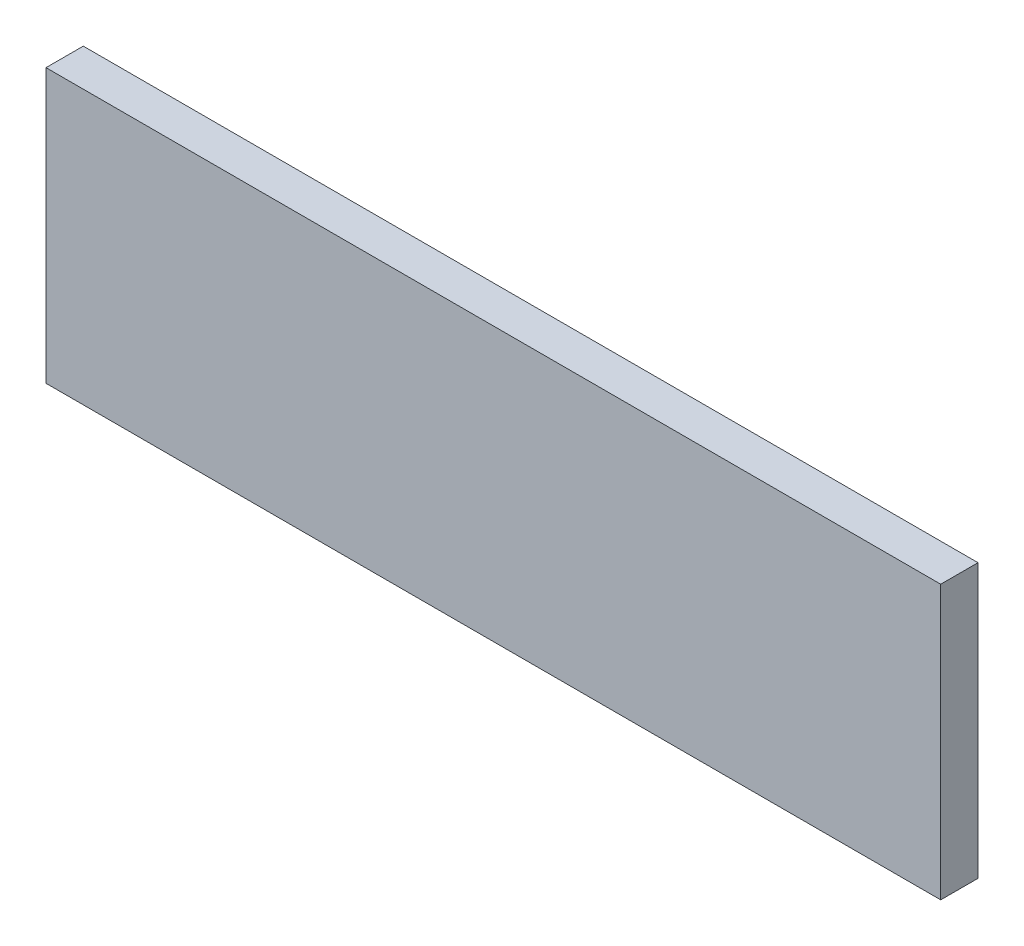
ISO-10303-21;
HEADER;
FILE_DESCRIPTION(('STEP AP214'),'2;1');
FILE_NAME('part.step','',(''),(''),'','','');
FILE_SCHEMA(('AUTOMOTIVE_DESIGN { 1 0 10303 214 1 1 1 1 }'));
ENDSEC;
DATA;
#1=APPLICATION_CONTEXT('core data for automotive mechanical design processes');
#2=APPLICATION_PROTOCOL_DEFINITION('international standard','automotive_design',2000,#1);
#3=PRODUCT_CONTEXT('',#1,'mechanical');
#4=PRODUCT('Part','Part','',(#3));
#5=PRODUCT_RELATED_PRODUCT_CATEGORY('part','',(#4));
#6=PRODUCT_DEFINITION_FORMATION('','',#4);
#7=PRODUCT_DEFINITION_CONTEXT('part definition',#1,'design');
#8=PRODUCT_DEFINITION('design','',#6,#7);
#9=PRODUCT_DEFINITION_SHAPE('','',#8);
#10=(LENGTH_UNIT() NAMED_UNIT(*) SI_UNIT(.MILLI.,.METRE.));
#11=(NAMED_UNIT(*) PLANE_ANGLE_UNIT() SI_UNIT($,.RADIAN.));
#12=(NAMED_UNIT(*) SI_UNIT($,.STERADIAN.) SOLID_ANGLE_UNIT());
#13=UNCERTAINTY_MEASURE_WITH_UNIT(LENGTH_MEASURE(1.E-05),#10,'distance_accuracy_value','');
#14=(GEOMETRIC_REPRESENTATION_CONTEXT(3) GLOBAL_UNCERTAINTY_ASSIGNED_CONTEXT((#13)) GLOBAL_UNIT_ASSIGNED_CONTEXT((#10,
#11,#12)) REPRESENTATION_CONTEXT('',''));
#15=CARTESIAN_POINT('',(0.,0.,0.));
#16=DIRECTION('',(0.,0.,1.));
#17=DIRECTION('',(1.,0.,0.));
#18=AXIS2_PLACEMENT_3D('',#15,#16,#17);
#19=CARTESIAN_POINT('',(52.3875,19.05,4.7625));
#20=DIRECTION('',(-1.,0.,0.));
#21=DIRECTION('',(0.,-1.,0.));
#22=AXIS2_PLACEMENT_3D('',#19,#20,#21);
#23=PLANE('',#22);
#24=DIRECTION('',(0.,1.,0.));
#25=VECTOR('',#24,1.);
#26=CARTESIAN_POINT('',(52.3875,19.05,0.));
#27=LINE('',#26,#25);
#28=CARTESIAN_POINT('',(52.3875,-15.875,0.));
#29=VERTEX_POINT('',#28);
#30=CARTESIAN_POINT('',(52.3875,19.05,0.));
#31=VERTEX_POINT('',#30);
#32=EDGE_CURVE('E96',#29,#31,#27,.T.);
#33=ORIENTED_EDGE('',*,*,#32,.T.);
#34=DIRECTION('',(0.,0.,-1.));
#35=VECTOR('',#34,1.);
#36=CARTESIAN_POINT('',(52.3875,19.05,4.7625));
#37=LINE('',#36,#35);
#38=CARTESIAN_POINT('',(52.3875,19.05,4.7625));
#39=VERTEX_POINT('',#38);
#40=EDGE_CURVE('E11',#39,#31,#37,.T.);
#41=ORIENTED_EDGE('',*,*,#40,.F.);
#42=DIRECTION('',(0.,1.,0.));
#43=VECTOR('',#42,1.);
#44=CARTESIAN_POINT('',(52.3875,19.05,4.7625));
#45=LINE('',#44,#43);
#46=CARTESIAN_POINT('',(52.3875,-15.875,4.7625));
#47=VERTEX_POINT('',#46);
#48=EDGE_CURVE('E84',#47,#39,#45,.T.);
#49=ORIENTED_EDGE('',*,*,#48,.F.);
#50=DIRECTION('',(0.,0.,-1.));
#51=VECTOR('',#50,1.);
#52=CARTESIAN_POINT('',(52.3875,-15.875,4.7625));
#53=LINE('',#52,#51);
#54=EDGE_CURVE('E92',#47,#29,#53,.T.);
#55=ORIENTED_EDGE('',*,*,#54,.T.);
#56=EDGE_LOOP('',(#33,#41,#49,#55));
#57=FACE_BOUND('',#56,.T.);
#58=ADVANCED_FACE('F33',(#57),#23,.F.);
#59=CARTESIAN_POINT('',(52.3875,19.05,4.7625));
#60=DIRECTION('',(0.,-1.,0.));
#61=DIRECTION('',(1.,0.,0.));
#62=AXIS2_PLACEMENT_3D('',#59,#60,#61);
#63=PLANE('',#62);
#64=DIRECTION('',(-1.,0.,0.));
#65=VECTOR('',#64,1.);
#66=CARTESIAN_POINT('',(52.3875,19.05,0.));
#67=LINE('',#66,#65);
#68=CARTESIAN_POINT('',(-61.9125,19.05,0.));
#69=VERTEX_POINT('',#68);
#70=EDGE_CURVE('E88',#31,#69,#67,.T.);
#71=ORIENTED_EDGE('',*,*,#70,.T.);
#72=DIRECTION('',(0.,0.,-1.));
#73=VECTOR('',#72,1.);
#74=CARTESIAN_POINT('',(-61.9125,19.05,4.7625));
#75=LINE('',#74,#73);
#76=CARTESIAN_POINT('',(-61.9125,19.05,4.7625));
#77=VERTEX_POINT('',#76);
#78=EDGE_CURVE('E41',#77,#69,#75,.T.);
#79=ORIENTED_EDGE('',*,*,#78,.F.);
#80=DIRECTION('',(-1.,0.,0.));
#81=VECTOR('',#80,1.);
#82=CARTESIAN_POINT('',(52.3875,19.05,4.7625));
#83=LINE('',#82,#81);
#84=EDGE_CURVE('E79',#39,#77,#83,.T.);
#85=ORIENTED_EDGE('',*,*,#84,.F.);
#86=ORIENTED_EDGE('',*,*,#40,.T.);
#87=EDGE_LOOP('',(#71,#79,#85,#86));
#88=FACE_BOUND('',#87,.T.);
#89=ADVANCED_FACE('F87',(#88),#63,.F.);
#90=CARTESIAN_POINT('',(-61.9125,19.05,4.7625));
#91=DIRECTION('',(1.,0.,0.));
#92=DIRECTION('',(0.,0.,-1.));
#93=AXIS2_PLACEMENT_3D('',#90,#91,#92);
#94=PLANE('',#93);
#95=DIRECTION('',(0.,-1.,0.));
#96=VECTOR('',#95,1.);
#97=CARTESIAN_POINT('',(-61.9125,19.05,0.));
#98=LINE('',#97,#96);
#99=CARTESIAN_POINT('',(-61.9125,-15.875,0.));
#100=VERTEX_POINT('',#99);
#101=EDGE_CURVE('E66',#69,#100,#98,.T.);
#102=ORIENTED_EDGE('',*,*,#101,.T.);
#103=DIRECTION('',(0.,0.,-1.));
#104=VECTOR('',#103,1.);
#105=CARTESIAN_POINT('',(-61.9125,-15.875,4.7625));
#106=LINE('',#105,#104);
#107=CARTESIAN_POINT('',(-61.9125,-15.875,4.7625));
#108=VERTEX_POINT('',#107);
#109=EDGE_CURVE('E89',#108,#100,#106,.T.);
#110=ORIENTED_EDGE('',*,*,#109,.F.);
#111=DIRECTION('',(0.,-1.,0.));
#112=VECTOR('',#111,1.);
#113=CARTESIAN_POINT('',(-61.9125,19.05,4.7625));
#114=LINE('',#113,#112);
#115=EDGE_CURVE('E82',#77,#108,#114,.T.);
#116=ORIENTED_EDGE('',*,*,#115,.F.);
#117=ORIENTED_EDGE('',*,*,#78,.T.);
#118=EDGE_LOOP('',(#102,#110,#116,#117));
#119=FACE_BOUND('',#118,.T.);
#120=ADVANCED_FACE('F90',(#119),#94,.F.);
#121=CARTESIAN_POINT('',(52.3875,-15.875,4.7625));
#122=DIRECTION('',(0.,1.,0.));
#123=DIRECTION('',(-1.,0.,0.));
#124=AXIS2_PLACEMENT_3D('',#121,#122,#123);
#125=PLANE('',#124);
#126=DIRECTION('',(1.,0.,0.));
#127=VECTOR('',#126,1.);
#128=CARTESIAN_POINT('',(52.3875,-15.875,0.));
#129=LINE('',#128,#127);
#130=EDGE_CURVE('E72',#100,#29,#129,.T.);
#131=ORIENTED_EDGE('',*,*,#130,.T.);
#132=ORIENTED_EDGE('',*,*,#54,.F.);
#133=DIRECTION('',(1.,0.,0.));
#134=VECTOR('',#133,1.);
#135=CARTESIAN_POINT('',(52.3875,-15.875,4.7625));
#136=LINE('',#135,#134);
#137=EDGE_CURVE('E49',#108,#47,#136,.T.);
#138=ORIENTED_EDGE('',*,*,#137,.F.);
#139=ORIENTED_EDGE('',*,*,#109,.T.);
#140=EDGE_LOOP('',(#131,#132,#138,#139));
#141=FACE_BOUND('',#140,.T.);
#142=ADVANCED_FACE('F103',(#141),#125,.F.);
#143=CARTESIAN_POINT('',(0.,0.,4.7625));
#144=DIRECTION('',(0.,0.,-1.));
#145=DIRECTION('',(-1.,0.,0.));
#146=AXIS2_PLACEMENT_3D('',#143,#144,#145);
#147=PLANE('',#146);
#148=ORIENTED_EDGE('',*,*,#48,.T.);
#149=ORIENTED_EDGE('',*,*,#84,.T.);
#150=ORIENTED_EDGE('',*,*,#115,.T.);
#151=ORIENTED_EDGE('',*,*,#137,.T.);
#152=EDGE_LOOP('',(#148,#149,#150,#151));
#153=FACE_BOUND('',#152,.T.);
#154=ADVANCED_FACE('F80',(#153),#147,.F.);
#155=CARTESIAN_POINT('',(0.,0.,0.));
#156=DIRECTION('',(0.,0.,-1.));
#157=DIRECTION('',(-1.,0.,0.));
#158=AXIS2_PLACEMENT_3D('',#155,#156,#157);
#159=PLANE('',#158);
#160=ORIENTED_EDGE('',*,*,#32,.F.);
#161=ORIENTED_EDGE('',*,*,#130,.F.);
#162=ORIENTED_EDGE('',*,*,#101,.F.);
#163=ORIENTED_EDGE('',*,*,#70,.F.);
#164=EDGE_LOOP('',(#160,#161,#162,#163));
#165=FACE_BOUND('',#164,.T.);
#166=ADVANCED_FACE('F106',(#165),#159,.T.);
#167=CLOSED_SHELL('',(#58,#89,#120,#142,#154,#166));
#168=MANIFOLD_SOLID_BREP('B2',#167);
#169=ADVANCED_BREP_SHAPE_REPRESENTATION('',(#18,#168),#14);
#170=SHAPE_DEFINITION_REPRESENTATION(#9,#169);
ENDSEC;
END-ISO-10303-21;
